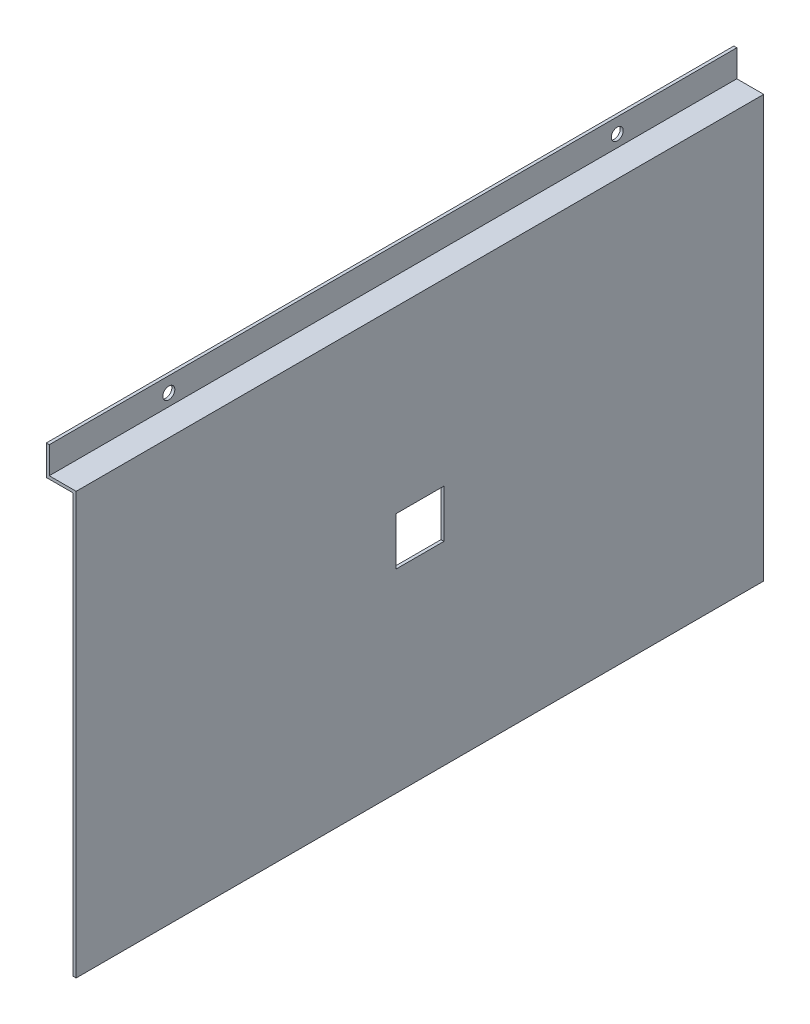
ISO-10303-21;
HEADER;
FILE_DESCRIPTION(('STEP AP214'),'2;1');
FILE_NAME('part.step','',(''),(''),'','','');
FILE_SCHEMA(('AUTOMOTIVE_DESIGN { 1 0 10303 214 1 1 1 1 }'));
ENDSEC;
DATA;
#1=APPLICATION_CONTEXT('core data for automotive mechanical design processes');
#2=APPLICATION_PROTOCOL_DEFINITION('international standard','automotive_design',2000,#1);
#3=PRODUCT_CONTEXT('',#1,'mechanical');
#4=PRODUCT('Part','Part','',(#3));
#5=PRODUCT_RELATED_PRODUCT_CATEGORY('part','',(#4));
#6=PRODUCT_DEFINITION_FORMATION('','',#4);
#7=PRODUCT_DEFINITION_CONTEXT('part definition',#1,'design');
#8=PRODUCT_DEFINITION('design','',#6,#7);
#9=PRODUCT_DEFINITION_SHAPE('','',#8);
#10=(LENGTH_UNIT() NAMED_UNIT(*) SI_UNIT(.MILLI.,.METRE.));
#11=(NAMED_UNIT(*) PLANE_ANGLE_UNIT() SI_UNIT($,.RADIAN.));
#12=(NAMED_UNIT(*) SI_UNIT($,.STERADIAN.) SOLID_ANGLE_UNIT());
#13=UNCERTAINTY_MEASURE_WITH_UNIT(LENGTH_MEASURE(1.E-05),#10,'distance_accuracy_value','');
#14=(GEOMETRIC_REPRESENTATION_CONTEXT(3) GLOBAL_UNCERTAINTY_ASSIGNED_CONTEXT((#13)) GLOBAL_UNIT_ASSIGNED_CONTEXT((#10,
#11,#12)) REPRESENTATION_CONTEXT('',''));
#15=CARTESIAN_POINT('',(0.,0.,0.));
#16=DIRECTION('',(0.,0.,1.));
#17=DIRECTION('',(1.,0.,0.));
#18=AXIS2_PLACEMENT_3D('',#15,#16,#17);
#19=CARTESIAN_POINT('',(-29.1189219456301,34.5866273106323,230.));
#20=DIRECTION('',(1.,0.,0.));
#21=DIRECTION('',(0.,1.,0.));
#22=AXIS2_PLACEMENT_3D('',#19,#20,#21);
#23=PLANE('',#22);
#24=DIRECTION('',(0.,0.,1.));
#25=VECTOR('',#24,1.);
#26=CARTESIAN_POINT('',(-29.1189219456301,-40.4394382436949,123.013032777164));
#27=LINE('',#26,#25);
#28=CARTESIAN_POINT('',(-29.1189219456301,-40.4394382436949,106.986967222836));
#29=VERTEX_POINT('',#28);
#30=CARTESIAN_POINT('',(-29.1189219456301,-40.4394382436949,123.013032777164));
#31=VERTEX_POINT('',#30);
#32=EDGE_CURVE('E273',#29,#31,#27,.T.);
#33=ORIENTED_EDGE('',*,*,#32,.F.);
#34=DIRECTION('',(0.,-1.,0.));
#35=VECTOR('',#34,1.);
#36=CARTESIAN_POINT('',(-29.1189219456301,-40.4394382436949,106.986967222836));
#37=LINE('',#36,#35);
#38=CARTESIAN_POINT('',(-29.1189219456301,-24.4133726893677,106.986967222836));
#39=VERTEX_POINT('',#38);
#40=EDGE_CURVE('E151',#39,#29,#37,.T.);
#41=ORIENTED_EDGE('',*,*,#40,.F.);
#42=DIRECTION('',(0.,0.,-1.));
#43=VECTOR('',#42,1.);
#44=CARTESIAN_POINT('',(-29.1189219456301,-24.4133726893677,123.013032777164));
#45=LINE('',#44,#43);
#46=CARTESIAN_POINT('',(-29.1189219456301,-24.4133726893677,123.013032777164));
#47=VERTEX_POINT('',#46);
#48=EDGE_CURVE('E148',#47,#39,#45,.T.);
#49=ORIENTED_EDGE('',*,*,#48,.F.);
#50=DIRECTION('',(0.,1.,0.));
#51=VECTOR('',#50,1.);
#52=CARTESIAN_POINT('',(-29.1189219456301,-40.4394382436949,123.013032777164));
#53=LINE('',#52,#51);
#54=EDGE_CURVE('E126',#31,#47,#53,.T.);
#55=ORIENTED_EDGE('',*,*,#54,.F.);
#56=EDGE_LOOP('',(#33,#41,#49,#55));
#57=FACE_BOUND('',#56,.T.);
#58=DIRECTION('',(0.,-1.,0.));
#59=VECTOR('',#58,1.);
#60=CARTESIAN_POINT('',(-29.1189219456301,34.5866273106323,0.));
#61=LINE('',#60,#59);
#62=CARTESIAN_POINT('',(-29.1189219456301,34.5866273106323,0.));
#63=VERTEX_POINT('',#62);
#64=CARTESIAN_POINT('',(-29.1189219456301,-105.413372689368,0.));
#65=VERTEX_POINT('',#64);
#66=EDGE_CURVE('E163',#63,#65,#61,.T.);
#67=ORIENTED_EDGE('',*,*,#66,.T.);
#68=DIRECTION('',(0.,0.,-1.));
#69=VECTOR('',#68,1.);
#70=CARTESIAN_POINT('',(-29.1189219456301,-105.413372689368,230.));
#71=LINE('',#70,#69);
#72=CARTESIAN_POINT('',(-29.1189219456301,-105.413372689368,230.));
#73=VERTEX_POINT('',#72);
#74=EDGE_CURVE('E11',#73,#65,#71,.T.);
#75=ORIENTED_EDGE('',*,*,#74,.F.);
#76=DIRECTION('',(0.,-1.,0.));
#77=VECTOR('',#76,1.);
#78=CARTESIAN_POINT('',(-29.1189219456301,34.5866273106323,230.));
#79=LINE('',#78,#77);
#80=CARTESIAN_POINT('',(-29.1189219456301,34.5866273106323,230.));
#81=VERTEX_POINT('',#80);
#82=EDGE_CURVE('E164',#81,#73,#79,.T.);
#83=ORIENTED_EDGE('',*,*,#82,.F.);
#84=DIRECTION('',(0.,0.,-1.));
#85=VECTOR('',#84,1.);
#86=CARTESIAN_POINT('',(-29.1189219456301,34.5866273106323,230.));
#87=LINE('',#86,#85);
#88=EDGE_CURVE('E186',#81,#63,#87,.T.);
#89=ORIENTED_EDGE('',*,*,#88,.T.);
#90=EDGE_LOOP('',(#67,#75,#83,#89));
#91=FACE_BOUND('',#90,.T.);
#92=ADVANCED_FACE('F33',(#57,#91),#23,.F.);
#93=CARTESIAN_POINT('',(-28.1189219456301,-105.413372689368,230.));
#94=DIRECTION('',(0.,-1.,0.));
#95=DIRECTION('',(0.,0.,-1.));
#96=AXIS2_PLACEMENT_3D('',#93,#94,#95);
#97=PLANE('',#96);
#98=DIRECTION('',(-1.,0.,0.));
#99=VECTOR('',#98,1.);
#100=CARTESIAN_POINT('',(-28.1189219456301,-105.413372689368,0.));
#101=LINE('',#100,#99);
#102=CARTESIAN_POINT('',(-28.1189219456301,-105.413372689368,0.));
#103=VERTEX_POINT('',#102);
#104=EDGE_CURVE('E189',#103,#65,#101,.T.);
#105=ORIENTED_EDGE('',*,*,#104,.F.);
#106=DIRECTION('',(0.,0.,-1.));
#107=VECTOR('',#106,1.);
#108=CARTESIAN_POINT('',(-28.1189219456301,-105.413372689368,230.));
#109=LINE('',#108,#107);
#110=CARTESIAN_POINT('',(-28.1189219456301,-105.413372689368,230.));
#111=VERTEX_POINT('',#110);
#112=EDGE_CURVE('E40',#111,#103,#109,.T.);
#113=ORIENTED_EDGE('',*,*,#112,.F.);
#114=DIRECTION('',(-1.,0.,0.));
#115=VECTOR('',#114,1.);
#116=CARTESIAN_POINT('',(-28.1189219456301,-105.413372689368,230.));
#117=LINE('',#116,#115);
#118=EDGE_CURVE('E166',#111,#73,#117,.T.);
#119=ORIENTED_EDGE('',*,*,#118,.T.);
#120=ORIENTED_EDGE('',*,*,#74,.T.);
#121=EDGE_LOOP('',(#105,#113,#119,#120));
#122=FACE_BOUND('',#121,.T.);
#123=ADVANCED_FACE('F224',(#122),#97,.T.);
#124=CARTESIAN_POINT('',(-28.1189219456301,34.5866273106323,230.));
#125=DIRECTION('',(1.,0.,0.));
#126=DIRECTION('',(0.,1.,0.));
#127=AXIS2_PLACEMENT_3D('',#124,#125,#126);
#128=PLANE('',#127);
#129=DIRECTION('',(0.,1.,0.));
#130=VECTOR('',#129,1.);
#131=CARTESIAN_POINT('',(-28.1189219456301,-40.4394382436949,106.986967222836));
#132=LINE('',#131,#130);
#133=CARTESIAN_POINT('',(-28.1189219456301,-40.4394382436949,106.986967222836));
#134=VERTEX_POINT('',#133);
#135=CARTESIAN_POINT('',(-28.1189219456301,-24.4133726893677,106.986967222836));
#136=VERTEX_POINT('',#135);
#137=EDGE_CURVE('E55',#134,#136,#132,.T.);
#138=ORIENTED_EDGE('',*,*,#137,.F.);
#139=DIRECTION('',(0.,0.,-1.));
#140=VECTOR('',#139,1.);
#141=CARTESIAN_POINT('',(-28.1189219456301,-40.4394382436949,123.013032777164));
#142=LINE('',#141,#140);
#143=CARTESIAN_POINT('',(-28.1189219456301,-40.4394382436949,123.013032777164));
#144=VERTEX_POINT('',#143);
#145=EDGE_CURVE('E139',#144,#134,#142,.T.);
#146=ORIENTED_EDGE('',*,*,#145,.F.);
#147=DIRECTION('',(0.,-1.,0.));
#148=VECTOR('',#147,1.);
#149=CARTESIAN_POINT('',(-28.1189219456301,-40.4394382436949,123.013032777164));
#150=LINE('',#149,#148);
#151=CARTESIAN_POINT('',(-28.1189219456301,-24.4133726893677,123.013032777164));
#152=VERTEX_POINT('',#151);
#153=EDGE_CURVE('E123',#152,#144,#150,.T.);
#154=ORIENTED_EDGE('',*,*,#153,.F.);
#155=DIRECTION('',(0.,0.,1.));
#156=VECTOR('',#155,1.);
#157=CARTESIAN_POINT('',(-28.1189219456301,-24.4133726893677,123.013032777164));
#158=LINE('',#157,#156);
#159=EDGE_CURVE('E132',#136,#152,#158,.T.);
#160=ORIENTED_EDGE('',*,*,#159,.F.);
#161=EDGE_LOOP('',(#138,#146,#154,#160));
#162=FACE_BOUND('',#161,.T.);
#163=DIRECTION('',(0.,-1.,0.));
#164=VECTOR('',#163,1.);
#165=CARTESIAN_POINT('',(-28.1189219456301,34.5866273106323,0.));
#166=LINE('',#165,#164);
#167=CARTESIAN_POINT('',(-28.1189219456301,35.5866273106323,0.));
#168=VERTEX_POINT('',#167);
#169=EDGE_CURVE('E192',#168,#103,#166,.T.);
#170=ORIENTED_EDGE('',*,*,#169,.F.);
#171=DIRECTION('',(0.,0.,-1.));
#172=VECTOR('',#171,1.);
#173=CARTESIAN_POINT('',(-28.1189219456301,35.5866273106323,230.));
#174=LINE('',#173,#172);
#175=CARTESIAN_POINT('',(-28.1189219456301,35.5866273106323,230.));
#176=VERTEX_POINT('',#175);
#177=EDGE_CURVE('E218',#176,#168,#174,.T.);
#178=ORIENTED_EDGE('',*,*,#177,.F.);
#179=DIRECTION('',(0.,-1.,0.));
#180=VECTOR('',#179,1.);
#181=CARTESIAN_POINT('',(-28.1189219456301,34.5866273106323,230.));
#182=LINE('',#181,#180);
#183=EDGE_CURVE('E170',#176,#111,#182,.T.);
#184=ORIENTED_EDGE('',*,*,#183,.T.);
#185=ORIENTED_EDGE('',*,*,#112,.T.);
#186=EDGE_LOOP('',(#170,#178,#184,#185));
#187=FACE_BOUND('',#186,.T.);
#188=ADVANCED_FACE('F136',(#162,#187),#128,.T.);
#189=CARTESIAN_POINT('',(-38.1189219456301,35.5866273106323,230.));
#190=DIRECTION('',(0.,1.,0.));
#191=DIRECTION('',(0.,0.,1.));
#192=AXIS2_PLACEMENT_3D('',#189,#190,#191);
#193=PLANE('',#192);
#194=DIRECTION('',(1.,0.,0.));
#195=VECTOR('',#194,1.);
#196=CARTESIAN_POINT('',(-38.1189219456301,35.5866273106323,0.));
#197=LINE('',#196,#195);
#198=CARTESIAN_POINT('',(-37.1189219456301,35.5866273106323,0.));
#199=VERTEX_POINT('',#198);
#200=EDGE_CURVE('E195',#199,#168,#197,.T.);
#201=ORIENTED_EDGE('',*,*,#200,.F.);
#202=DIRECTION('',(0.,0.,-1.));
#203=VECTOR('',#202,1.);
#204=CARTESIAN_POINT('',(-37.1189219456301,35.5866273106323,230.));
#205=LINE('',#204,#203);
#206=CARTESIAN_POINT('',(-37.1189219456301,35.5866273106323,230.));
#207=VERTEX_POINT('',#206);
#208=EDGE_CURVE('E216',#207,#199,#205,.T.);
#209=ORIENTED_EDGE('',*,*,#208,.F.);
#210=DIRECTION('',(1.,0.,0.));
#211=VECTOR('',#210,1.);
#212=CARTESIAN_POINT('',(-38.1189219456301,35.5866273106323,230.));
#213=LINE('',#212,#211);
#214=EDGE_CURVE('E173',#207,#176,#213,.T.);
#215=ORIENTED_EDGE('',*,*,#214,.T.);
#216=ORIENTED_EDGE('',*,*,#177,.T.);
#217=EDGE_LOOP('',(#201,#209,#215,#216));
#218=FACE_BOUND('',#217,.T.);
#219=ADVANCED_FACE('F232',(#218),#193,.T.);
#220=CARTESIAN_POINT('',(-37.1189219456301,44.5866273106323,230.));
#221=DIRECTION('',(1.,0.,0.));
#222=DIRECTION('',(0.,0.,-1.));
#223=AXIS2_PLACEMENT_3D('',#220,#221,#222);
#224=PLANE('',#223);
#225=CARTESIAN_POINT('',(-37.1189219456301,39.5866273106323,40.));
#226=DIRECTION('',(1.,0.,0.));
#227=DIRECTION('',(0.,0.,-1.));
#228=AXIS2_PLACEMENT_3D('',#225,#226,#227);
#229=CIRCLE('',#228,2.);
#230=CARTESIAN_POINT('',(-37.1189219456301,39.5866273106323,38.));
#231=VERTEX_POINT('',#230);
#232=EDGE_CURVE('E150',#231,#231,#229,.T.);
#233=ORIENTED_EDGE('',*,*,#232,.F.);
#234=EDGE_LOOP('',(#233));
#235=FACE_BOUND('',#234,.T.);
#236=CARTESIAN_POINT('',(-37.1189219456301,39.5866273106323,190.));
#237=DIRECTION('',(1.,0.,0.));
#238=DIRECTION('',(0.,0.,-1.));
#239=AXIS2_PLACEMENT_3D('',#236,#237,#238);
#240=CIRCLE('',#239,2.);
#241=CARTESIAN_POINT('',(-37.1189219456301,39.5866273106323,188.));
#242=VERTEX_POINT('',#241);
#243=EDGE_CURVE('E157',#242,#242,#240,.T.);
#244=ORIENTED_EDGE('',*,*,#243,.F.);
#245=EDGE_LOOP('',(#244));
#246=FACE_BOUND('',#245,.T.);
#247=DIRECTION('',(0.,1.,0.));
#248=VECTOR('',#247,1.);
#249=CARTESIAN_POINT('',(-37.1189219456301,44.5866273106323,0.));
#250=LINE('',#249,#248);
#251=CARTESIAN_POINT('',(-37.1189219456301,44.5866273106323,0.));
#252=VERTEX_POINT('',#251);
#253=EDGE_CURVE('E198',#252,#199,#250,.F.);
#254=ORIENTED_EDGE('',*,*,#253,.F.);
#255=DIRECTION('',(0.,0.,-1.));
#256=VECTOR('',#255,1.);
#257=CARTESIAN_POINT('',(-37.1189219456301,44.5866273106323,230.));
#258=LINE('',#257,#256);
#259=CARTESIAN_POINT('',(-37.1189219456301,44.5866273106323,230.));
#260=VERTEX_POINT('',#259);
#261=EDGE_CURVE('E214',#260,#252,#258,.T.);
#262=ORIENTED_EDGE('',*,*,#261,.F.);
#263=DIRECTION('',(0.,1.,0.));
#264=VECTOR('',#263,1.);
#265=CARTESIAN_POINT('',(-37.1189219456301,44.5866273106323,230.));
#266=LINE('',#265,#264);
#267=EDGE_CURVE('E176',#260,#207,#266,.F.);
#268=ORIENTED_EDGE('',*,*,#267,.T.);
#269=ORIENTED_EDGE('',*,*,#208,.T.);
#270=EDGE_LOOP('',(#254,#262,#268,#269));
#271=FACE_BOUND('',#270,.T.);
#272=ADVANCED_FACE('F254',(#235,#246,#271),#224,.T.);
#273=CARTESIAN_POINT('',(-38.1189219456301,44.5866273106323,230.));
#274=DIRECTION('',(0.,1.,0.));
#275=DIRECTION('',(0.,0.,1.));
#276=AXIS2_PLACEMENT_3D('',#273,#274,#275);
#277=PLANE('',#276);
#278=DIRECTION('',(1.,0.,0.));
#279=VECTOR('',#278,1.);
#280=CARTESIAN_POINT('',(-38.1189219456301,44.5866273106323,0.));
#281=LINE('',#280,#279);
#282=CARTESIAN_POINT('',(-38.1189219456301,44.5866273106323,0.));
#283=VERTEX_POINT('',#282);
#284=EDGE_CURVE('E201',#283,#252,#281,.T.);
#285=ORIENTED_EDGE('',*,*,#284,.F.);
#286=DIRECTION('',(0.,0.,-1.));
#287=VECTOR('',#286,1.);
#288=CARTESIAN_POINT('',(-38.1189219456301,44.5866273106323,230.));
#289=LINE('',#288,#287);
#290=CARTESIAN_POINT('',(-38.1189219456301,44.5866273106323,230.));
#291=VERTEX_POINT('',#290);
#292=EDGE_CURVE('E212',#291,#283,#289,.T.);
#293=ORIENTED_EDGE('',*,*,#292,.F.);
#294=DIRECTION('',(1.,0.,0.));
#295=VECTOR('',#294,1.);
#296=CARTESIAN_POINT('',(-38.1189219456301,44.5866273106323,230.));
#297=LINE('',#296,#295);
#298=EDGE_CURVE('E179',#291,#260,#297,.T.);
#299=ORIENTED_EDGE('',*,*,#298,.T.);
#300=ORIENTED_EDGE('',*,*,#261,.T.);
#301=EDGE_LOOP('',(#285,#293,#299,#300));
#302=FACE_BOUND('',#301,.T.);
#303=ADVANCED_FACE('F252',(#302),#277,.T.);
#304=CARTESIAN_POINT('',(-38.1189219456301,44.5866273106323,230.));
#305=DIRECTION('',(1.,0.,0.));
#306=DIRECTION('',(0.,0.,-1.));
#307=AXIS2_PLACEMENT_3D('',#304,#305,#306);
#308=PLANE('',#307);
#309=CARTESIAN_POINT('',(-38.1189219456301,39.5866273106323,40.));
#310=DIRECTION('',(1.,0.,0.));
#311=DIRECTION('',(0.,0.,-1.));
#312=AXIS2_PLACEMENT_3D('',#309,#310,#311);
#313=CIRCLE('',#312,2.);
#314=CARTESIAN_POINT('',(-38.1189219456301,39.5866273106323,38.));
#315=VERTEX_POINT('',#314);
#316=EDGE_CURVE('E154',#315,#315,#313,.F.);
#317=ORIENTED_EDGE('',*,*,#316,.F.);
#318=EDGE_LOOP('',(#317));
#319=FACE_BOUND('',#318,.T.);
#320=CARTESIAN_POINT('',(-38.1189219456301,39.5866273106323,190.));
#321=DIRECTION('',(1.,0.,0.));
#322=DIRECTION('',(0.,0.,-1.));
#323=AXIS2_PLACEMENT_3D('',#320,#321,#322);
#324=CIRCLE('',#323,2.);
#325=CARTESIAN_POINT('',(-38.1189219456301,39.5866273106323,188.));
#326=VERTEX_POINT('',#325);
#327=EDGE_CURVE('E160',#326,#326,#324,.F.);
#328=ORIENTED_EDGE('',*,*,#327,.F.);
#329=EDGE_LOOP('',(#328));
#330=FACE_BOUND('',#329,.T.);
#331=DIRECTION('',(0.,-1.,0.));
#332=VECTOR('',#331,1.);
#333=CARTESIAN_POINT('',(-38.1189219456301,44.5866273106323,0.));
#334=LINE('',#333,#332);
#335=CARTESIAN_POINT('',(-38.1189219456301,34.5866273106323,0.));
#336=VERTEX_POINT('',#335);
#337=EDGE_CURVE('E204',#283,#336,#334,.T.);
#338=ORIENTED_EDGE('',*,*,#337,.T.);
#339=DIRECTION('',(0.,0.,-1.));
#340=VECTOR('',#339,1.);
#341=CARTESIAN_POINT('',(-38.1189219456301,34.5866273106323,230.));
#342=LINE('',#341,#340);
#343=CARTESIAN_POINT('',(-38.1189219456301,34.5866273106323,230.));
#344=VERTEX_POINT('',#343);
#345=EDGE_CURVE('E209',#344,#336,#342,.T.);
#346=ORIENTED_EDGE('',*,*,#345,.F.);
#347=DIRECTION('',(0.,-1.,0.));
#348=VECTOR('',#347,1.);
#349=CARTESIAN_POINT('',(-38.1189219456301,44.5866273106323,230.));
#350=LINE('',#349,#348);
#351=EDGE_CURVE('E182',#291,#344,#350,.T.);
#352=ORIENTED_EDGE('',*,*,#351,.F.);
#353=ORIENTED_EDGE('',*,*,#292,.T.);
#354=EDGE_LOOP('',(#338,#346,#352,#353));
#355=FACE_BOUND('',#354,.T.);
#356=ADVANCED_FACE('F249',(#319,#330,#355),#308,.F.);
#357=CARTESIAN_POINT('',(-38.1189219456301,34.5866273106323,230.));
#358=DIRECTION('',(0.,1.,0.));
#359=DIRECTION('',(0.,0.,1.));
#360=AXIS2_PLACEMENT_3D('',#357,#358,#359);
#361=PLANE('',#360);
#362=DIRECTION('',(1.,0.,0.));
#363=VECTOR('',#362,1.);
#364=CARTESIAN_POINT('',(-38.1189219456301,34.5866273106323,0.));
#365=LINE('',#364,#363);
#366=EDGE_CURVE('E167',#336,#63,#365,.T.);
#367=ORIENTED_EDGE('',*,*,#366,.T.);
#368=ORIENTED_EDGE('',*,*,#88,.F.);
#369=DIRECTION('',(1.,0.,0.));
#370=VECTOR('',#369,1.);
#371=CARTESIAN_POINT('',(-38.1189219456301,34.5866273106323,230.));
#372=LINE('',#371,#370);
#373=EDGE_CURVE('E184',#344,#81,#372,.T.);
#374=ORIENTED_EDGE('',*,*,#373,.F.);
#375=ORIENTED_EDGE('',*,*,#345,.T.);
#376=EDGE_LOOP('',(#367,#368,#374,#375));
#377=FACE_BOUND('',#376,.T.);
#378=ADVANCED_FACE('F245',(#377),#361,.F.);
#379=CARTESIAN_POINT('',(0.,0.,230.));
#380=DIRECTION('',(0.,0.,-1.));
#381=DIRECTION('',(-1.,0.,0.));
#382=AXIS2_PLACEMENT_3D('',#379,#380,#381);
#383=PLANE('',#382);
#384=ORIENTED_EDGE('',*,*,#82,.T.);
#385=ORIENTED_EDGE('',*,*,#118,.F.);
#386=ORIENTED_EDGE('',*,*,#183,.F.);
#387=ORIENTED_EDGE('',*,*,#214,.F.);
#388=ORIENTED_EDGE('',*,*,#267,.F.);
#389=ORIENTED_EDGE('',*,*,#298,.F.);
#390=ORIENTED_EDGE('',*,*,#351,.T.);
#391=ORIENTED_EDGE('',*,*,#373,.T.);
#392=EDGE_LOOP('',(#384,#385,#386,#387,#388,#389,#390,#391));
#393=FACE_BOUND('',#392,.T.);
#394=ADVANCED_FACE('F235',(#393),#383,.F.);
#395=CARTESIAN_POINT('',(0.,0.,0.));
#396=DIRECTION('',(0.,0.,-1.));
#397=DIRECTION('',(-1.,0.,0.));
#398=AXIS2_PLACEMENT_3D('',#395,#396,#397);
#399=PLANE('',#398);
#400=ORIENTED_EDGE('',*,*,#66,.F.);
#401=ORIENTED_EDGE('',*,*,#366,.F.);
#402=ORIENTED_EDGE('',*,*,#337,.F.);
#403=ORIENTED_EDGE('',*,*,#284,.T.);
#404=ORIENTED_EDGE('',*,*,#253,.T.);
#405=ORIENTED_EDGE('',*,*,#200,.T.);
#406=ORIENTED_EDGE('',*,*,#169,.T.);
#407=ORIENTED_EDGE('',*,*,#104,.T.);
#408=EDGE_LOOP('',(#400,#401,#402,#403,#404,#405,#406,#407));
#409=FACE_BOUND('',#408,.T.);
#410=ADVANCED_FACE('F228',(#409),#399,.T.);
#411=CARTESIAN_POINT('',(-43.7757761951225,39.5866273106323,190.));
#412=DIRECTION('',(1.,0.,0.));
#413=DIRECTION('',(0.,0.,-1.));
#414=AXIS2_PLACEMENT_3D('',#411,#412,#413);
#415=CYLINDRICAL_SURFACE('',#414,2.);
#416=ORIENTED_EDGE('',*,*,#327,.T.);
#417=EDGE_LOOP('',(#416));
#418=FACE_BOUND('',#417,.T.);
#419=ORIENTED_EDGE('',*,*,#243,.T.);
#420=EDGE_LOOP('',(#419));
#421=FACE_BOUND('',#420,.T.);
#422=ADVANCED_FACE('F295',(#418,#421),#415,.F.);
#423=CARTESIAN_POINT('',(-43.7757761951225,39.5866273106323,40.));
#424=DIRECTION('',(1.,0.,0.));
#425=DIRECTION('',(0.,0.,-1.));
#426=AXIS2_PLACEMENT_3D('',#423,#424,#425);
#427=CYLINDRICAL_SURFACE('',#426,2.);
#428=ORIENTED_EDGE('',*,*,#316,.T.);
#429=EDGE_LOOP('',(#428));
#430=FACE_BOUND('',#429,.T.);
#431=ORIENTED_EDGE('',*,*,#232,.T.);
#432=EDGE_LOOP('',(#431));
#433=FACE_BOUND('',#432,.T.);
#434=ADVANCED_FACE('F288',(#430,#433),#427,.F.);
#435=CARTESIAN_POINT('',(-51.7832012040399,-40.4394382436949,106.986967222836));
#436=DIRECTION('',(0.,0.,-1.));
#437=DIRECTION('',(-1.,0.,0.));
#438=AXIS2_PLACEMENT_3D('',#435,#436,#437);
#439=PLANE('',#438);
#440=ORIENTED_EDGE('',*,*,#40,.T.);
#441=DIRECTION('',(1.,0.,0.));
#442=VECTOR('',#441,1.);
#443=CARTESIAN_POINT('',(-51.7832012040399,-40.4394382436949,106.986967222836));
#444=LINE('',#443,#442);
#445=EDGE_CURVE('E144',#29,#134,#444,.T.);
#446=ORIENTED_EDGE('',*,*,#445,.T.);
#447=ORIENTED_EDGE('',*,*,#137,.T.);
#448=DIRECTION('',(1.,0.,0.));
#449=VECTOR('',#448,1.);
#450=CARTESIAN_POINT('',(-51.7832012040399,-24.4133726893677,106.986967222836));
#451=LINE('',#450,#449);
#452=EDGE_CURVE('E129',#39,#136,#451,.T.);
#453=ORIENTED_EDGE('',*,*,#452,.F.);
#454=EDGE_LOOP('',(#440,#446,#447,#453));
#455=FACE_BOUND('',#454,.T.);
#456=ADVANCED_FACE('F279',(#455),#439,.F.);
#457=CARTESIAN_POINT('',(-51.7832012040399,-40.4394382436949,123.013032777164));
#458=DIRECTION('',(0.,-1.,0.));
#459=DIRECTION('',(1.,0.,0.));
#460=AXIS2_PLACEMENT_3D('',#457,#458,#459);
#461=PLANE('',#460);
#462=ORIENTED_EDGE('',*,*,#32,.T.);
#463=DIRECTION('',(1.,0.,0.));
#464=VECTOR('',#463,1.);
#465=CARTESIAN_POINT('',(-51.7832012040399,-40.4394382436949,123.013032777164));
#466=LINE('',#465,#464);
#467=EDGE_CURVE('E128',#31,#144,#466,.T.);
#468=ORIENTED_EDGE('',*,*,#467,.T.);
#469=ORIENTED_EDGE('',*,*,#145,.T.);
#470=ORIENTED_EDGE('',*,*,#445,.F.);
#471=EDGE_LOOP('',(#462,#468,#469,#470));
#472=FACE_BOUND('',#471,.T.);
#473=ADVANCED_FACE('F280',(#472),#461,.F.);
#474=CARTESIAN_POINT('',(-51.7832012040399,-40.4394382436949,123.013032777164));
#475=DIRECTION('',(0.,0.,1.));
#476=DIRECTION('',(1.,0.,0.));
#477=AXIS2_PLACEMENT_3D('',#474,#475,#476);
#478=PLANE('',#477);
#479=ORIENTED_EDGE('',*,*,#54,.T.);
#480=DIRECTION('',(1.,0.,0.));
#481=VECTOR('',#480,1.);
#482=CARTESIAN_POINT('',(-51.7832012040399,-24.4133726893677,123.013032777164));
#483=LINE('',#482,#481);
#484=EDGE_CURVE('E47',#47,#152,#483,.T.);
#485=ORIENTED_EDGE('',*,*,#484,.T.);
#486=ORIENTED_EDGE('',*,*,#153,.T.);
#487=ORIENTED_EDGE('',*,*,#467,.F.);
#488=EDGE_LOOP('',(#479,#485,#486,#487));
#489=FACE_BOUND('',#488,.T.);
#490=ADVANCED_FACE('F120',(#489),#478,.F.);
#491=CARTESIAN_POINT('',(-51.7832012040399,-24.4133726893677,123.013032777164));
#492=DIRECTION('',(0.,1.,0.));
#493=DIRECTION('',(-1.,0.,0.));
#494=AXIS2_PLACEMENT_3D('',#491,#492,#493);
#495=PLANE('',#494);
#496=ORIENTED_EDGE('',*,*,#48,.T.);
#497=ORIENTED_EDGE('',*,*,#452,.T.);
#498=ORIENTED_EDGE('',*,*,#159,.T.);
#499=ORIENTED_EDGE('',*,*,#484,.F.);
#500=EDGE_LOOP('',(#496,#497,#498,#499));
#501=FACE_BOUND('',#500,.T.);
#502=ADVANCED_FACE('F133',(#501),#495,.F.);
#503=CLOSED_SHELL('',(#92,#123,#188,#219,#272,#303,#356,#378,#394,#410,#422,#434,#456,#473,#490,#502));
#504=MANIFOLD_SOLID_BREP('B2',#503);
#505=ADVANCED_BREP_SHAPE_REPRESENTATION('',(#18,#504),#14);
#506=SHAPE_DEFINITION_REPRESENTATION(#9,#505);
ENDSEC;
END-ISO-10303-21;
